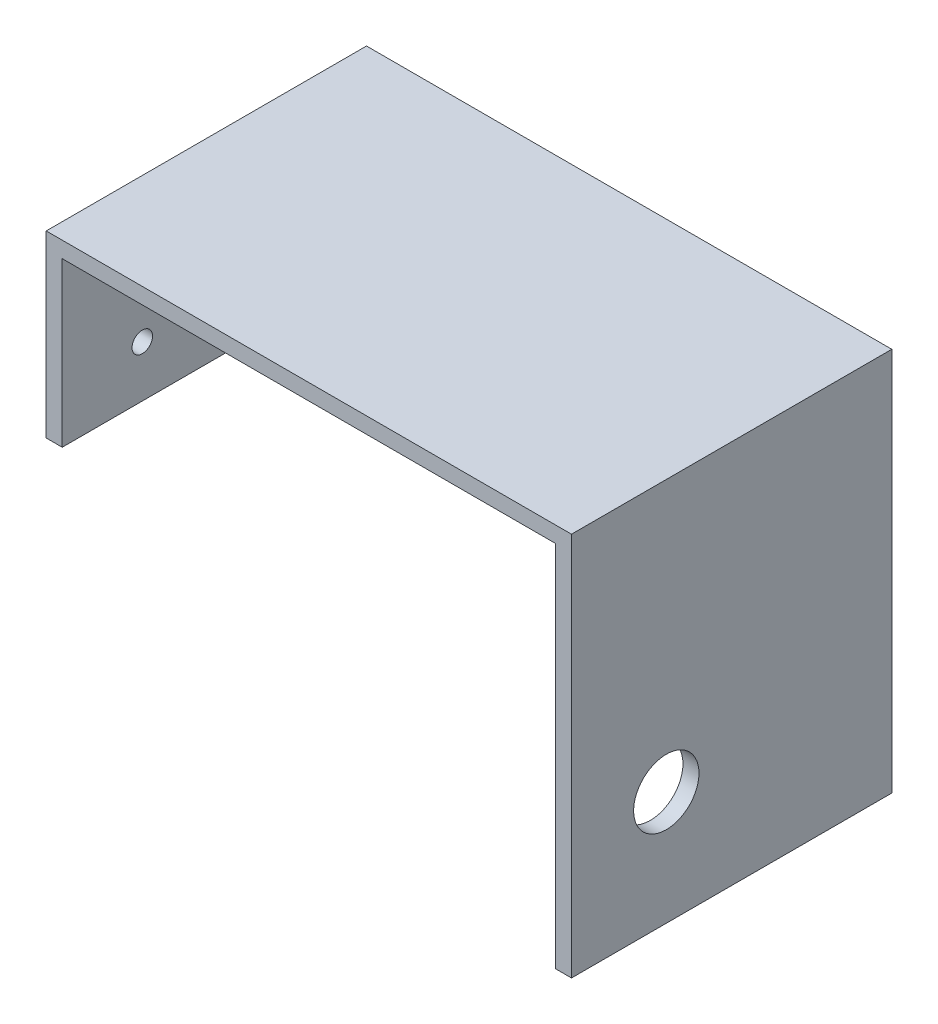
ISO-10303-21;
HEADER;
FILE_DESCRIPTION(('STEP AP214'),'2;1');
FILE_NAME('part.step','',(''),(''),'','','');
FILE_SCHEMA(('AUTOMOTIVE_DESIGN { 1 0 10303 214 1 1 1 1 }'));
ENDSEC;
DATA;
#1=APPLICATION_CONTEXT('core data for automotive mechanical design processes');
#2=APPLICATION_PROTOCOL_DEFINITION('international standard','automotive_design',2000,#1);
#3=PRODUCT_CONTEXT('',#1,'mechanical');
#4=PRODUCT('Part','Part','',(#3));
#5=PRODUCT_RELATED_PRODUCT_CATEGORY('part','',(#4));
#6=PRODUCT_DEFINITION_FORMATION('','',#4);
#7=PRODUCT_DEFINITION_CONTEXT('part definition',#1,'design');
#8=PRODUCT_DEFINITION('design','',#6,#7);
#9=PRODUCT_DEFINITION_SHAPE('','',#8);
#10=(LENGTH_UNIT() NAMED_UNIT(*) SI_UNIT(.MILLI.,.METRE.));
#11=(NAMED_UNIT(*) PLANE_ANGLE_UNIT() SI_UNIT($,.RADIAN.));
#12=(NAMED_UNIT(*) SI_UNIT($,.STERADIAN.) SOLID_ANGLE_UNIT());
#13=UNCERTAINTY_MEASURE_WITH_UNIT(LENGTH_MEASURE(1.E-05),#10,'distance_accuracy_value','');
#14=(GEOMETRIC_REPRESENTATION_CONTEXT(3) GLOBAL_UNCERTAINTY_ASSIGNED_CONTEXT((#13)) GLOBAL_UNIT_ASSIGNED_CONTEXT((#10,
#11,#12)) REPRESENTATION_CONTEXT('',''));
#15=CARTESIAN_POINT('',(0.,0.,0.));
#16=DIRECTION('',(0.,0.,1.));
#17=DIRECTION('',(1.,0.,0.));
#18=AXIS2_PLACEMENT_3D('',#15,#16,#17);
#19=CARTESIAN_POINT('',(0.,-60.,50.));
#20=DIRECTION('',(-1.,0.,0.));
#21=DIRECTION('',(0.,0.,1.));
#22=AXIS2_PLACEMENT_3D('',#19,#20,#21);
#23=PLANE('',#22);
#24=CARTESIAN_POINT('',(0.,-42.25,35.2));
#25=DIRECTION('',(1.,0.,0.));
#26=DIRECTION('',(0.,0.,-1.));
#27=AXIS2_PLACEMENT_3D('',#24,#25,#26);
#28=CIRCLE('',#27,5.1);
#29=CARTESIAN_POINT('',(0.,-42.25,30.1));
#30=VERTEX_POINT('',#29);
#31=EDGE_CURVE('E193',#30,#30,#28,.T.);
#32=ORIENTED_EDGE('',*,*,#31,.F.);
#33=EDGE_LOOP('',(#32));
#34=FACE_BOUND('',#33,.T.);
#35=DIRECTION('',(0.,1.,0.));
#36=VECTOR('',#35,1.);
#37=CARTESIAN_POINT('',(0.,-60.,0.));
#38=LINE('',#37,#36);
#39=CARTESIAN_POINT('',(0.,-60.,0.));
#40=VERTEX_POINT('',#39);
#41=CARTESIAN_POINT('',(0.,0.,0.));
#42=VERTEX_POINT('',#41);
#43=EDGE_CURVE('E131',#40,#42,#38,.T.);
#44=ORIENTED_EDGE('',*,*,#43,.T.);
#45=DIRECTION('',(0.,0.,-1.));
#46=VECTOR('',#45,1.);
#47=CARTESIAN_POINT('',(0.,0.,50.));
#48=LINE('',#47,#46);
#49=CARTESIAN_POINT('',(0.,0.,50.));
#50=VERTEX_POINT('',#49);
#51=EDGE_CURVE('E11',#50,#42,#48,.T.);
#52=ORIENTED_EDGE('',*,*,#51,.F.);
#53=DIRECTION('',(0.,1.,0.));
#54=VECTOR('',#53,1.);
#55=CARTESIAN_POINT('',(0.,-60.,50.));
#56=LINE('',#55,#54);
#57=CARTESIAN_POINT('',(0.,-60.,50.));
#58=VERTEX_POINT('',#57);
#59=EDGE_CURVE('E146',#58,#50,#56,.T.);
#60=ORIENTED_EDGE('',*,*,#59,.F.);
#61=DIRECTION('',(0.,0.,-1.));
#62=VECTOR('',#61,1.);
#63=CARTESIAN_POINT('',(0.,-60.,50.));
#64=LINE('',#63,#62);
#65=EDGE_CURVE('E127',#58,#40,#64,.T.);
#66=ORIENTED_EDGE('',*,*,#65,.T.);
#67=EDGE_LOOP('',(#44,#52,#60,#66));
#68=FACE_BOUND('',#67,.T.);
#69=ADVANCED_FACE('F33',(#34,#68),#23,.F.);
#70=CARTESIAN_POINT('',(0.,0.,50.));
#71=DIRECTION('',(0.,-1.,0.));
#72=DIRECTION('',(1.,0.,0.));
#73=AXIS2_PLACEMENT_3D('',#70,#71,#72);
#74=PLANE('',#73);
#75=DIRECTION('',(-1.,0.,0.));
#76=VECTOR('',#75,1.);
#77=CARTESIAN_POINT('',(0.,0.,0.));
#78=LINE('',#77,#76);
#79=CARTESIAN_POINT('',(-82.,0.,0.));
#80=VERTEX_POINT('',#79);
#81=EDGE_CURVE('E134',#42,#80,#78,.T.);
#82=ORIENTED_EDGE('',*,*,#81,.T.);
#83=DIRECTION('',(0.,0.,-1.));
#84=VECTOR('',#83,1.);
#85=CARTESIAN_POINT('',(-82.,0.,50.));
#86=LINE('',#85,#84);
#87=CARTESIAN_POINT('',(-82.,0.,50.));
#88=VERTEX_POINT('',#87);
#89=EDGE_CURVE('E42',#88,#80,#86,.T.);
#90=ORIENTED_EDGE('',*,*,#89,.F.);
#91=DIRECTION('',(-1.,0.,0.));
#92=VECTOR('',#91,1.);
#93=CARTESIAN_POINT('',(0.,0.,50.));
#94=LINE('',#93,#92);
#95=EDGE_CURVE('E94',#50,#88,#94,.T.);
#96=ORIENTED_EDGE('',*,*,#95,.F.);
#97=ORIENTED_EDGE('',*,*,#51,.T.);
#98=EDGE_LOOP('',(#82,#90,#96,#97));
#99=FACE_BOUND('',#98,.T.);
#100=ADVANCED_FACE('F184',(#99),#74,.F.);
#101=CARTESIAN_POINT('',(-82.,0.,50.));
#102=DIRECTION('',(1.,0.,0.));
#103=DIRECTION('',(0.,0.,-1.));
#104=AXIS2_PLACEMENT_3D('',#101,#102,#103);
#105=PLANE('',#104);
#106=CARTESIAN_POINT('',(-82.,-20.,12.5));
#107=DIRECTION('',(-1.,0.,0.));
#108=DIRECTION('',(0.,0.,1.));
#109=AXIS2_PLACEMENT_3D('',#106,#107,#108);
#110=CIRCLE('',#109,1.6);
#111=CARTESIAN_POINT('',(-82.,-20.,14.1));
#112=VERTEX_POINT('',#111);
#113=EDGE_CURVE('E160',#112,#112,#110,.T.);
#114=ORIENTED_EDGE('',*,*,#113,.F.);
#115=EDGE_LOOP('',(#114));
#116=FACE_BOUND('',#115,.T.);
#117=CARTESIAN_POINT('',(-82.,-20.,37.5));
#118=DIRECTION('',(-1.,0.,0.));
#119=DIRECTION('',(0.,0.,1.));
#120=AXIS2_PLACEMENT_3D('',#117,#118,#119);
#121=CIRCLE('',#120,1.6);
#122=CARTESIAN_POINT('',(-82.,-20.,39.1));
#123=VERTEX_POINT('',#122);
#124=EDGE_CURVE('E211',#123,#123,#121,.T.);
#125=ORIENTED_EDGE('',*,*,#124,.F.);
#126=EDGE_LOOP('',(#125));
#127=FACE_BOUND('',#126,.T.);
#128=DIRECTION('',(0.,-1.,0.));
#129=VECTOR('',#128,1.);
#130=CARTESIAN_POINT('',(-82.,0.,0.));
#131=LINE('',#130,#129);
#132=CARTESIAN_POINT('',(-82.,-28.,0.));
#133=VERTEX_POINT('',#132);
#134=EDGE_CURVE('E137',#80,#133,#131,.T.);
#135=ORIENTED_EDGE('',*,*,#134,.T.);
#136=DIRECTION('',(0.,0.,-1.));
#137=VECTOR('',#136,1.);
#138=CARTESIAN_POINT('',(-82.,-28.,50.));
#139=LINE('',#138,#137);
#140=CARTESIAN_POINT('',(-82.,-28.,50.));
#141=VERTEX_POINT('',#140);
#142=EDGE_CURVE('E153',#141,#133,#139,.T.);
#143=ORIENTED_EDGE('',*,*,#142,.F.);
#144=DIRECTION('',(0.,-1.,0.));
#145=VECTOR('',#144,1.);
#146=CARTESIAN_POINT('',(-82.,0.,50.));
#147=LINE('',#146,#145);
#148=EDGE_CURVE('E203',#88,#141,#147,.T.);
#149=ORIENTED_EDGE('',*,*,#148,.F.);
#150=ORIENTED_EDGE('',*,*,#89,.T.);
#151=EDGE_LOOP('',(#135,#143,#149,#150));
#152=FACE_BOUND('',#151,.T.);
#153=ADVANCED_FACE('F189',(#116,#127,#152),#105,.F.);
#154=CARTESIAN_POINT('',(-82.,-28.,50.));
#155=DIRECTION('',(0.,1.,0.));
#156=DIRECTION('',(0.,0.,1.));
#157=AXIS2_PLACEMENT_3D('',#154,#155,#156);
#158=PLANE('',#157);
#159=DIRECTION('',(1.,0.,0.));
#160=VECTOR('',#159,1.);
#161=CARTESIAN_POINT('',(-82.,-28.,0.));
#162=LINE('',#161,#160);
#163=CARTESIAN_POINT('',(-79.5,-28.,0.));
#164=VERTEX_POINT('',#163);
#165=EDGE_CURVE('E139',#133,#164,#162,.T.);
#166=ORIENTED_EDGE('',*,*,#165,.T.);
#167=DIRECTION('',(0.,0.,-1.));
#168=VECTOR('',#167,1.);
#169=CARTESIAN_POINT('',(-79.5,-28.,50.));
#170=LINE('',#169,#168);
#171=CARTESIAN_POINT('',(-79.5,-28.,50.));
#172=VERTEX_POINT('',#171);
#173=EDGE_CURVE('E150',#172,#164,#170,.T.);
#174=ORIENTED_EDGE('',*,*,#173,.F.);
#175=DIRECTION('',(1.,0.,0.));
#176=VECTOR('',#175,1.);
#177=CARTESIAN_POINT('',(-82.,-28.,50.));
#178=LINE('',#177,#176);
#179=EDGE_CURVE('E205',#141,#172,#178,.T.);
#180=ORIENTED_EDGE('',*,*,#179,.F.);
#181=ORIENTED_EDGE('',*,*,#142,.T.);
#182=EDGE_LOOP('',(#166,#174,#180,#181));
#183=FACE_BOUND('',#182,.T.);
#184=ADVANCED_FACE('F232',(#183),#158,.F.);
#185=CARTESIAN_POINT('',(-79.5,-28.,50.));
#186=DIRECTION('',(-1.,0.,0.));
#187=DIRECTION('',(0.,0.,1.));
#188=AXIS2_PLACEMENT_3D('',#185,#186,#187);
#189=PLANE('',#188);
#190=CARTESIAN_POINT('',(-79.5,-20.,12.5));
#191=DIRECTION('',(-1.,0.,0.));
#192=DIRECTION('',(0.,0.,1.));
#193=AXIS2_PLACEMENT_3D('',#190,#191,#192);
#194=CIRCLE('',#193,1.6);
#195=CARTESIAN_POINT('',(-79.5,-20.,14.1));
#196=VERTEX_POINT('',#195);
#197=EDGE_CURVE('E135',#196,#196,#194,.T.);
#198=ORIENTED_EDGE('',*,*,#197,.T.);
#199=EDGE_LOOP('',(#198));
#200=FACE_BOUND('',#199,.T.);
#201=CARTESIAN_POINT('',(-79.5,-20.,37.5));
#202=DIRECTION('',(-1.,0.,0.));
#203=DIRECTION('',(0.,0.,1.));
#204=AXIS2_PLACEMENT_3D('',#201,#202,#203);
#205=CIRCLE('',#204,1.6);
#206=CARTESIAN_POINT('',(-79.5,-20.,39.1));
#207=VERTEX_POINT('',#206);
#208=EDGE_CURVE('E158',#207,#207,#205,.T.);
#209=ORIENTED_EDGE('',*,*,#208,.T.);
#210=EDGE_LOOP('',(#209));
#211=FACE_BOUND('',#210,.T.);
#212=DIRECTION('',(0.,1.,0.));
#213=VECTOR('',#212,1.);
#214=CARTESIAN_POINT('',(-79.5,-28.,0.));
#215=LINE('',#214,#213);
#216=CARTESIAN_POINT('',(-79.5,-2.50000000000001,0.));
#217=VERTEX_POINT('',#216);
#218=EDGE_CURVE('E141',#164,#217,#215,.T.);
#219=ORIENTED_EDGE('',*,*,#218,.T.);
#220=DIRECTION('',(0.,0.,-1.));
#221=VECTOR('',#220,1.);
#222=CARTESIAN_POINT('',(-79.5,-2.50000000000001,50.));
#223=LINE('',#222,#221);
#224=CARTESIAN_POINT('',(-79.5,-2.50000000000001,50.));
#225=VERTEX_POINT('',#224);
#226=EDGE_CURVE('E122',#225,#217,#223,.T.);
#227=ORIENTED_EDGE('',*,*,#226,.F.);
#228=DIRECTION('',(0.,1.,0.));
#229=VECTOR('',#228,1.);
#230=CARTESIAN_POINT('',(-79.5,-28.,50.));
#231=LINE('',#230,#229);
#232=EDGE_CURVE('E113',#172,#225,#231,.T.);
#233=ORIENTED_EDGE('',*,*,#232,.F.);
#234=ORIENTED_EDGE('',*,*,#173,.T.);
#235=EDGE_LOOP('',(#219,#227,#233,#234));
#236=FACE_BOUND('',#235,.T.);
#237=ADVANCED_FACE('F164',(#200,#211,#236),#189,.F.);
#238=CARTESIAN_POINT('',(-79.5,-2.50000000000001,50.));
#239=DIRECTION('',(0.,1.,0.));
#240=DIRECTION('',(-1.,0.,0.));
#241=AXIS2_PLACEMENT_3D('',#238,#239,#240);
#242=PLANE('',#241);
#243=DIRECTION('',(1.,0.,0.));
#244=VECTOR('',#243,1.);
#245=CARTESIAN_POINT('',(-79.5,-2.50000000000001,0.));
#246=LINE('',#245,#244);
#247=CARTESIAN_POINT('',(-2.5,-2.5,0.));
#248=VERTEX_POINT('',#247);
#249=EDGE_CURVE('E121',#217,#248,#246,.T.);
#250=ORIENTED_EDGE('',*,*,#249,.T.);
#251=DIRECTION('',(0.,0.,-1.));
#252=VECTOR('',#251,1.);
#253=CARTESIAN_POINT('',(-2.5,-2.5,50.));
#254=LINE('',#253,#252);
#255=CARTESIAN_POINT('',(-2.5,-2.5,50.));
#256=VERTEX_POINT('',#255);
#257=EDGE_CURVE('E118',#256,#248,#254,.T.);
#258=ORIENTED_EDGE('',*,*,#257,.F.);
#259=DIRECTION('',(1.,0.,0.));
#260=VECTOR('',#259,1.);
#261=CARTESIAN_POINT('',(-79.5,-2.50000000000001,50.));
#262=LINE('',#261,#260);
#263=EDGE_CURVE('E107',#225,#256,#262,.T.);
#264=ORIENTED_EDGE('',*,*,#263,.F.);
#265=ORIENTED_EDGE('',*,*,#226,.T.);
#266=EDGE_LOOP('',(#250,#258,#264,#265));
#267=FACE_BOUND('',#266,.T.);
#268=ADVANCED_FACE('F119',(#267),#242,.F.);
#269=CARTESIAN_POINT('',(-2.5,-2.5,50.));
#270=DIRECTION('',(1.,0.,0.));
#271=DIRECTION('',(0.,1.,0.));
#272=AXIS2_PLACEMENT_3D('',#269,#270,#271);
#273=PLANE('',#272);
#274=CARTESIAN_POINT('',(-2.5,-42.25,35.2));
#275=DIRECTION('',(1.,0.,0.));
#276=DIRECTION('',(0.,1.,0.));
#277=AXIS2_PLACEMENT_3D('',#274,#275,#276);
#278=CIRCLE('',#277,5.1);
#279=CARTESIAN_POINT('',(-2.5,-37.15,35.2));
#280=VERTEX_POINT('',#279);
#281=EDGE_CURVE('E36',#280,#280,#278,.T.);
#282=ORIENTED_EDGE('',*,*,#281,.T.);
#283=EDGE_LOOP('',(#282));
#284=FACE_BOUND('',#283,.T.);
#285=DIRECTION('',(0.,-1.,0.));
#286=VECTOR('',#285,1.);
#287=CARTESIAN_POINT('',(-2.5,-2.5,0.));
#288=LINE('',#287,#286);
#289=CARTESIAN_POINT('',(-2.49999999999999,-60.,0.));
#290=VERTEX_POINT('',#289);
#291=EDGE_CURVE('E80',#248,#290,#288,.T.);
#292=ORIENTED_EDGE('',*,*,#291,.T.);
#293=DIRECTION('',(0.,0.,-1.));
#294=VECTOR('',#293,1.);
#295=CARTESIAN_POINT('',(-2.49999999999999,-60.,50.));
#296=LINE('',#295,#294);
#297=CARTESIAN_POINT('',(-2.49999999999999,-60.,50.));
#298=VERTEX_POINT('',#297);
#299=EDGE_CURVE('E123',#298,#290,#296,.T.);
#300=ORIENTED_EDGE('',*,*,#299,.F.);
#301=DIRECTION('',(0.,-1.,0.));
#302=VECTOR('',#301,1.);
#303=CARTESIAN_POINT('',(-2.5,-2.5,50.));
#304=LINE('',#303,#302);
#305=EDGE_CURVE('E111',#256,#298,#304,.T.);
#306=ORIENTED_EDGE('',*,*,#305,.F.);
#307=ORIENTED_EDGE('',*,*,#257,.T.);
#308=EDGE_LOOP('',(#292,#300,#306,#307));
#309=FACE_BOUND('',#308,.T.);
#310=ADVANCED_FACE('F125',(#284,#309),#273,.F.);
#311=CARTESIAN_POINT('',(-2.49999999999999,-60.,50.));
#312=DIRECTION('',(0.,1.,0.));
#313=DIRECTION('',(0.,0.,1.));
#314=AXIS2_PLACEMENT_3D('',#311,#312,#313);
#315=PLANE('',#314);
#316=DIRECTION('',(1.,0.,0.));
#317=VECTOR('',#316,1.);
#318=CARTESIAN_POINT('',(-2.49999999999999,-60.,0.));
#319=LINE('',#318,#317);
#320=EDGE_CURVE('E86',#290,#40,#319,.T.);
#321=ORIENTED_EDGE('',*,*,#320,.T.);
#322=ORIENTED_EDGE('',*,*,#65,.F.);
#323=DIRECTION('',(1.,0.,0.));
#324=VECTOR('',#323,1.);
#325=CARTESIAN_POINT('',(-2.49999999999999,-60.,50.));
#326=LINE('',#325,#324);
#327=EDGE_CURVE('E51',#298,#58,#326,.T.);
#328=ORIENTED_EDGE('',*,*,#327,.F.);
#329=ORIENTED_EDGE('',*,*,#299,.T.);
#330=EDGE_LOOP('',(#321,#322,#328,#329));
#331=FACE_BOUND('',#330,.T.);
#332=ADVANCED_FACE('F220',(#331),#315,.F.);
#333=CARTESIAN_POINT('',(0.,0.,50.));
#334=DIRECTION('',(0.,0.,1.));
#335=DIRECTION('',(1.,0.,0.));
#336=AXIS2_PLACEMENT_3D('',#333,#334,#335);
#337=PLANE('',#336);
#338=ORIENTED_EDGE('',*,*,#59,.T.);
#339=ORIENTED_EDGE('',*,*,#95,.T.);
#340=ORIENTED_EDGE('',*,*,#148,.T.);
#341=ORIENTED_EDGE('',*,*,#179,.T.);
#342=ORIENTED_EDGE('',*,*,#232,.T.);
#343=ORIENTED_EDGE('',*,*,#263,.T.);
#344=ORIENTED_EDGE('',*,*,#305,.T.);
#345=ORIENTED_EDGE('',*,*,#327,.T.);
#346=EDGE_LOOP('',(#338,#339,#340,#341,#342,#343,#344,#345));
#347=FACE_BOUND('',#346,.T.);
#348=ADVANCED_FACE('F109',(#347),#337,.T.);
#349=CARTESIAN_POINT('',(0.,0.,0.));
#350=DIRECTION('',(0.,0.,1.));
#351=DIRECTION('',(1.,0.,0.));
#352=AXIS2_PLACEMENT_3D('',#349,#350,#351);
#353=PLANE('',#352);
#354=ORIENTED_EDGE('',*,*,#43,.F.);
#355=ORIENTED_EDGE('',*,*,#320,.F.);
#356=ORIENTED_EDGE('',*,*,#291,.F.);
#357=ORIENTED_EDGE('',*,*,#249,.F.);
#358=ORIENTED_EDGE('',*,*,#218,.F.);
#359=ORIENTED_EDGE('',*,*,#165,.F.);
#360=ORIENTED_EDGE('',*,*,#134,.F.);
#361=ORIENTED_EDGE('',*,*,#81,.F.);
#362=EDGE_LOOP('',(#354,#355,#356,#357,#358,#359,#360,#361));
#363=FACE_BOUND('',#362,.T.);
#364=ADVANCED_FACE('F179',(#363),#353,.F.);
#365=CARTESIAN_POINT('',(-32.,-20.,37.5));
#366=DIRECTION('',(-1.,0.,0.));
#367=DIRECTION('',(0.,0.,1.));
#368=AXIS2_PLACEMENT_3D('',#365,#366,#367);
#369=CYLINDRICAL_SURFACE('',#368,1.6);
#370=ORIENTED_EDGE('',*,*,#124,.T.);
#371=EDGE_LOOP('',(#370));
#372=FACE_BOUND('',#371,.T.);
#373=ORIENTED_EDGE('',*,*,#208,.F.);
#374=EDGE_LOOP('',(#373));
#375=FACE_BOUND('',#374,.T.);
#376=ADVANCED_FACE('F170',(#372,#375),#369,.F.);
#377=CARTESIAN_POINT('',(-32.,-20.,12.5));
#378=DIRECTION('',(-1.,0.,0.));
#379=DIRECTION('',(0.,0.,1.));
#380=AXIS2_PLACEMENT_3D('',#377,#378,#379);
#381=CYLINDRICAL_SURFACE('',#380,1.6);
#382=ORIENTED_EDGE('',*,*,#113,.T.);
#383=EDGE_LOOP('',(#382));
#384=FACE_BOUND('',#383,.T.);
#385=ORIENTED_EDGE('',*,*,#197,.F.);
#386=EDGE_LOOP('',(#385));
#387=FACE_BOUND('',#386,.T.);
#388=ADVANCED_FACE('F167',(#384,#387),#381,.F.);
#389=CARTESIAN_POINT('',(-50.,-42.25,35.2));
#390=DIRECTION('',(1.,0.,0.));
#391=DIRECTION('',(0.,0.,-1.));
#392=AXIS2_PLACEMENT_3D('',#389,#390,#391);
#393=CYLINDRICAL_SURFACE('',#392,5.1);
#394=ORIENTED_EDGE('',*,*,#31,.T.);
#395=EDGE_LOOP('',(#394));
#396=FACE_BOUND('',#395,.T.);
#397=ORIENTED_EDGE('',*,*,#281,.F.);
#398=EDGE_LOOP('',(#397));
#399=FACE_BOUND('',#398,.T.);
#400=ADVANCED_FACE('F169',(#396,#399),#393,.F.);
#401=CLOSED_SHELL('',(#69,#100,#153,#184,#237,#268,#310,#332,#348,#364,#376,#388,#400));
#402=MANIFOLD_SOLID_BREP('B2',#401);
#403=ADVANCED_BREP_SHAPE_REPRESENTATION('',(#18,#402),#14);
#404=SHAPE_DEFINITION_REPRESENTATION(#9,#403);
ENDSEC;
END-ISO-10303-21;
